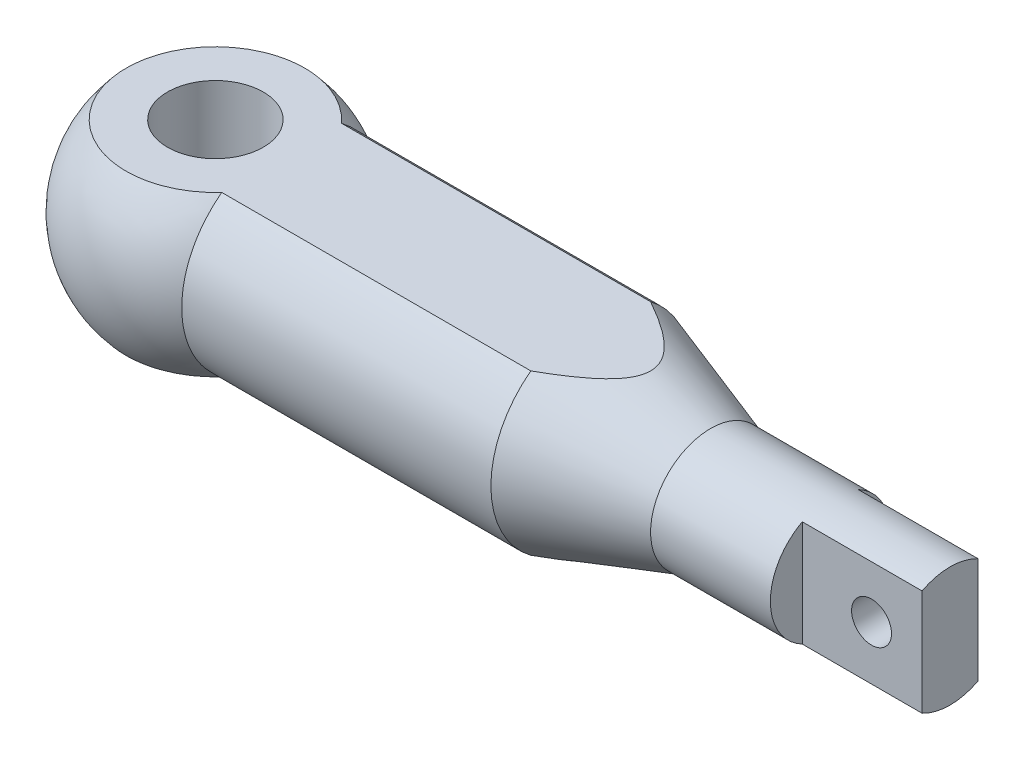
ISO-10303-21;
HEADER;
FILE_DESCRIPTION(('STEP AP214'),'2;1');
FILE_NAME('part.step','',(''),(''),'','','');
FILE_SCHEMA(('AUTOMOTIVE_DESIGN { 1 0 10303 214 1 1 1 1 }'));
ENDSEC;
DATA;
#1=APPLICATION_CONTEXT('core data for automotive mechanical design processes');
#2=APPLICATION_PROTOCOL_DEFINITION('international standard','automotive_design',2000,#1);
#3=PRODUCT_CONTEXT('',#1,'mechanical');
#4=PRODUCT('Part','Part','',(#3));
#5=PRODUCT_RELATED_PRODUCT_CATEGORY('part','',(#4));
#6=PRODUCT_DEFINITION_FORMATION('','',#4);
#7=PRODUCT_DEFINITION_CONTEXT('part definition',#1,'design');
#8=PRODUCT_DEFINITION('design','',#6,#7);
#9=PRODUCT_DEFINITION_SHAPE('','',#8);
#10=(LENGTH_UNIT() NAMED_UNIT(*) SI_UNIT(.MILLI.,.METRE.));
#11=(NAMED_UNIT(*) PLANE_ANGLE_UNIT() SI_UNIT($,.RADIAN.));
#12=(NAMED_UNIT(*) SI_UNIT($,.STERADIAN.) SOLID_ANGLE_UNIT());
#13=UNCERTAINTY_MEASURE_WITH_UNIT(LENGTH_MEASURE(1.E-05),#10,'distance_accuracy_value','');
#14=(GEOMETRIC_REPRESENTATION_CONTEXT(3) GLOBAL_UNCERTAINTY_ASSIGNED_CONTEXT((#13)) GLOBAL_UNIT_ASSIGNED_CONTEXT((#10,
#11,#12)) REPRESENTATION_CONTEXT('',''));
#15=CARTESIAN_POINT('',(0.,0.,0.));
#16=DIRECTION('',(0.,0.,1.));
#17=DIRECTION('',(1.,0.,0.));
#18=AXIS2_PLACEMENT_3D('',#15,#16,#17);
#19=CARTESIAN_POINT('',(-92.6244681900514,0.,-6.63865581350529));
#20=DIRECTION('',(1.,0.,0.));
#21=DIRECTION('',(0.,0.,-1.));
#22=AXIS2_PLACEMENT_3D('',#19,#20,#21);
#23=CYLINDRICAL_SURFACE('',#22,12.5);
#24=CARTESIAN_POINT('',(-131.332906214163,0.,-6.63865581350529));
#25=DIRECTION('',(-1.,0.,0.));
#26=DIRECTION('',(0.,0.,1.));
#27=AXIS2_PLACEMENT_3D('',#24,#25,#26);
#28=CIRCLE('',#27,12.5);
#29=CARTESIAN_POINT('',(-131.332906214163,10.,-14.1386558135053));
#30=VERTEX_POINT('',#29);
#31=CARTESIAN_POINT('',(-131.332906214163,-9.99999999999999,-14.1386558135053));
#32=VERTEX_POINT('',#31);
#33=EDGE_CURVE('E112',#30,#32,#28,.T.);
#34=ORIENTED_EDGE('',*,*,#33,.F.);
#35=DIRECTION('',(1.,0.,0.));
#36=VECTOR('',#35,1.);
#37=CARTESIAN_POINT('',(-92.6244681900514,10.,-14.1386558135053));
#38=LINE('',#37,#36);
#39=CARTESIAN_POINT('',(-92.6244681900514,10.,-14.1386558135053));
#40=VERTEX_POINT('',#39);
#41=EDGE_CURVE('E179',#30,#40,#38,.T.);
#42=ORIENTED_EDGE('',*,*,#41,.T.);
#43=CARTESIAN_POINT('',(-92.6244681900514,0.,-6.63865581350529));
#44=DIRECTION('',(1.,0.,0.));
#45=DIRECTION('',(0.,0.,-1.));
#46=AXIS2_PLACEMENT_3D('',#43,#44,#45);
#47=CIRCLE('',#46,12.5);
#48=CARTESIAN_POINT('',(-92.6244681900514,-10.,-14.1386558135053));
#49=VERTEX_POINT('',#48);
#50=EDGE_CURVE('E123',#49,#40,#47,.T.);
#51=ORIENTED_EDGE('',*,*,#50,.F.);
#52=DIRECTION('',(1.,0.,0.));
#53=VECTOR('',#52,1.);
#54=CARTESIAN_POINT('',(-92.6244681900514,-9.99999999999999,-14.1386558135053));
#55=LINE('',#54,#53);
#56=EDGE_CURVE('E58',#49,#32,#55,.F.);
#57=ORIENTED_EDGE('',*,*,#56,.T.);
#58=EDGE_LOOP('',(#34,#42,#51,#57));
#59=FACE_BOUND('',#58,.T.);
#60=ADVANCED_FACE('F37',(#59),#23,.T.);
#61=CARTESIAN_POINT('',(-92.6244681900514,10.,0.861344186494716));
#62=VERTEX_POINT('',#61);
#63=CARTESIAN_POINT('',(-92.6244681900514,-10.,0.861344186494717));
#64=VERTEX_POINT('',#63);
#65=EDGE_CURVE('E117',#62,#64,#47,.T.);
#66=ORIENTED_EDGE('',*,*,#65,.F.);
#67=DIRECTION('',(1.,0.,0.));
#68=VECTOR('',#67,1.);
#69=CARTESIAN_POINT('',(-92.6244681900514,10.,0.861344186494719));
#70=LINE('',#69,#68);
#71=CARTESIAN_POINT('',(-131.332906214163,10.,0.861344186494719));
#72=VERTEX_POINT('',#71);
#73=EDGE_CURVE('E66',#62,#72,#70,.F.);
#74=ORIENTED_EDGE('',*,*,#73,.T.);
#75=CARTESIAN_POINT('',(-131.332906214163,-9.99999999999999,0.861344186494722));
#76=VERTEX_POINT('',#75);
#77=EDGE_CURVE('E119',#76,#72,#28,.T.);
#78=ORIENTED_EDGE('',*,*,#77,.F.);
#79=DIRECTION('',(1.,0.,0.));
#80=VECTOR('',#79,1.);
#81=CARTESIAN_POINT('',(-92.6244681900514,-9.99999999999999,0.861344186494722));
#82=LINE('',#81,#80);
#83=EDGE_CURVE('E106',#76,#64,#82,.T.);
#84=ORIENTED_EDGE('',*,*,#83,.T.);
#85=EDGE_LOOP('',(#66,#74,#78,#84));
#86=FACE_BOUND('',#85,.T.);
#87=ADVANCED_FACE('F116',(#86),#23,.T.);
#88=CARTESIAN_POINT('',(-139.624468190051,0.,-6.63865581350528));
#89=DIRECTION('',(0.,0.,-1.));
#90=DIRECTION('',(1.,0.,0.));
#91=AXIS2_PLACEMENT_3D('',#88,#89,#90);
#92=SPHERICAL_SURFACE('',#91,15.);
#93=CARTESIAN_POINT('',(-139.624468190051,10.,-6.63865581350528));
#94=DIRECTION('',(0.,-1.,0.));
#95=DIRECTION('',(0.,0.,-1.));
#96=AXIS2_PLACEMENT_3D('',#93,#94,#95);
#97=CIRCLE('',#96,11.180339887499);
#98=EDGE_CURVE('E182',#30,#72,#97,.F.);
#99=ORIENTED_EDGE('',*,*,#98,.F.);
#100=ORIENTED_EDGE('',*,*,#33,.T.);
#101=CARTESIAN_POINT('',(-139.624468190051,-9.99999999999999,-6.63865581350528));
#102=DIRECTION('',(0.,1.,0.));
#103=DIRECTION('',(0.,0.,1.));
#104=AXIS2_PLACEMENT_3D('',#101,#102,#103);
#105=CIRCLE('',#104,11.180339887499);
#106=EDGE_CURVE('E120',#76,#32,#105,.F.);
#107=ORIENTED_EDGE('',*,*,#106,.F.);
#108=ORIENTED_EDGE('',*,*,#77,.T.);
#109=EDGE_LOOP('',(#99,#100,#107,#108));
#110=FACE_BOUND('',#109,.T.);
#111=ADVANCED_FACE('F39',(#110),#92,.T.);
#112=CARTESIAN_POINT('',(-92.6244681900514,0.,-6.63865581350529));
#113=DIRECTION('',(-1.,0.,0.));
#114=DIRECTION('',(0.,0.,1.));
#115=AXIS2_PLACEMENT_3D('',#112,#113,#114);
#116=CONICAL_SURFACE('',#115,12.5,0.321750554396642);
#117=CARTESIAN_POINT('',(-77.6244681900514,0.,-6.63865581350529));
#118=DIRECTION('',(1.,0.,0.));
#119=DIRECTION('',(0.,0.,-1.));
#120=AXIS2_PLACEMENT_3D('',#117,#118,#119);
#121=CIRCLE('',#120,7.5);
#122=CARTESIAN_POINT('',(-77.6244681900514,0.,-14.1386558135053));
#123=VERTEX_POINT('',#122);
#124=EDGE_CURVE('E126',#123,#123,#121,.T.);
#125=ORIENTED_EDGE('',*,*,#124,.F.);
#126=EDGE_LOOP('',(#125));
#127=FACE_BOUND('',#126,.T.);
#128=ORIENTED_EDGE('',*,*,#50,.T.);
#129=CARTESIAN_POINT('',(-121.779427664278,10.,-26.4793648692455));
#130=CARTESIAN_POINT('',(-121.130548010512,10.,-26.2371478958745));
#131=CARTESIAN_POINT('',(-120.481959643929,10.,-25.9941502551752));
#132=CARTESIAN_POINT('',(-119.185443163569,10.,-25.5063937667457));
#133=CARTESIAN_POINT('',(-118.537515051965,10.,-25.2616349132431));
#134=CARTESIAN_POINT('',(-116.594540228996,10.,-24.5243038361841));
#135=CARTESIAN_POINT('',(-115.300607495463,10.,-24.0287905336603));
#136=CARTESIAN_POINT('',(-112.705686292803,10.,-23.023586346845));
#137=CARTESIAN_POINT('',(-111.404730400938,10.,-22.5138111181957));
#138=CARTESIAN_POINT('',(-109.457386265429,10.,-21.7392200652283));
#139=CARTESIAN_POINT('',(-108.809013293169,10.,-21.479392977028));
#140=CARTESIAN_POINT('',(-107.513832788663,10.,-20.9558684319987));
#141=CARTESIAN_POINT('',(-106.867025250984,10.,-20.6921709886235));
#142=CARTESIAN_POINT('',(-105.559168002477,10.,-20.1536249826445));
#143=CARTESIAN_POINT('',(-104.898165220469,10.,-19.8786623110203));
#144=CARTESIAN_POINT('',(-103.578534767736,10.,-19.323098401483));
#145=CARTESIAN_POINT('',(-102.919907085158,10.,-19.0424971917563));
#146=CARTESIAN_POINT('',(-101.60517316354,10.,-18.4743397867359));
#147=CARTESIAN_POINT('',(-100.94906870752,10.,-18.1867794535823));
#148=CARTESIAN_POINT('',(-99.9677061908876,10.,-17.7492121246883));
#149=CARTESIAN_POINT('',(-99.6410577665366,10.,-17.6023216427271));
#150=CARTESIAN_POINT('',(-98.9888052377269,10.,-17.3062127651444));
#151=CARTESIAN_POINT('',(-98.6632011668529,10.,-17.1569942955456));
#152=CARTESIAN_POINT('',(-97.6907476711874,10.,-16.7066421734972));
#153=CARTESIAN_POINT('',(-97.0456710995572,10.,-16.401663830004));
#154=CARTESIAN_POINT('',(-95.7618439987822,10.,-15.778672010683));
#155=CARTESIAN_POINT('',(-95.123093125406,10.,-15.4606592490547));
#156=CARTESIAN_POINT('',(-94.171881892732,10.,-14.9709131981561));
#157=CARTESIAN_POINT('',(-93.856104353577,10.,-14.8056204999535));
#158=CARTESIAN_POINT('',(-93.2272208562557,10.,-14.4700358568874));
#159=CARTESIAN_POINT('',(-92.9141148233823,10.,-14.2997440524164));
#160=CARTESIAN_POINT('',(-92.2912401262045,10.,-13.9533431426747));
#161=CARTESIAN_POINT('',(-91.9814706023879,10.,-13.7772355855412));
#162=CARTESIAN_POINT('',(-91.3659967151568,10.,-13.4180708894724));
#163=CARTESIAN_POINT('',(-91.0602920314276,10.,-13.2350143025647));
#164=CARTESIAN_POINT('',(-90.6510744880192,10.,-12.9822179765534));
#165=CARTESIAN_POINT('',(-90.545284188346,10.,-12.9161554040945));
#166=CARTESIAN_POINT('',(-90.3343986992276,10.,-12.7829218531069));
#167=CARTESIAN_POINT('',(-90.2293035342014,10.,-12.7157508359272));
#168=CARTESIAN_POINT('',(-89.9151394658254,10.,-12.5124434472673));
#169=CARTESIAN_POINT('',(-89.7072159525002,10.,-12.3745274883004));
#170=CARTESIAN_POINT('',(-89.2944150842397,10.,-12.092725179218));
#171=CARTESIAN_POINT('',(-89.0895503729655,10.,-11.9488202562136));
#172=CARTESIAN_POINT('',(-88.6845287135352,10.,-11.6545366367654));
#173=CARTESIAN_POINT('',(-88.4843714292528,10.,-11.5041584047215));
#174=CARTESIAN_POINT('',(-88.074328011181,10.,-11.1834656904766));
#175=CARTESIAN_POINT('',(-87.8649346911664,10.,-11.0125169229483));
#176=CARTESIAN_POINT('',(-87.4552802995181,10.,-10.6597091720403));
#177=CARTESIAN_POINT('',(-87.2550239201953,10.,-10.4778446914302));
#178=CARTESIAN_POINT('',(-86.8680683825543,10.,-10.1017329242397));
#179=CARTESIAN_POINT('',(-86.6813136660311,10.,-9.90754338625416));
#180=CARTESIAN_POINT('',(-86.3258619879075,10.,-9.50343305887667));
#181=CARTESIAN_POINT('',(-86.157140709843,10.,-9.29353411891332));
#182=CARTESIAN_POINT('',(-85.8694688065469,10.,-8.88831486893656));
#183=CARTESIAN_POINT('',(-85.7468512675186,10.,-8.695630976746));
#184=CARTESIAN_POINT('',(-85.5277370258856,10.,-8.2954716593344));
#185=CARTESIAN_POINT('',(-85.4312336764483,10.,-8.08800001505096));
#186=CARTESIAN_POINT('',(-85.3125601728823,10.,-7.7653903994878));
#187=CARTESIAN_POINT('',(-85.2771812820496,10.,-7.65506306411063));
#188=CARTESIAN_POINT('',(-85.2167943490211,10.,-7.43163012086403));
#189=CARTESIAN_POINT('',(-85.1917802050758,10.,-7.31852618924683));
#190=CARTESIAN_POINT('',(-85.1531457710165,10.,-7.09054737959656));
#191=CARTESIAN_POINT('',(-85.1395084053625,10.,-6.97567542012015));
#192=CARTESIAN_POINT('',(-85.1241781954301,10.,-6.74513793843437));
#193=CARTESIAN_POINT('',(-85.1224836674986,10.,-6.6294725303836));
#194=CARTESIAN_POINT('',(-85.130538042847,10.,-6.41394619089712));
#195=CARTESIAN_POINT('',(-85.1387969314058,10.,-6.31402656858507));
#196=CARTESIAN_POINT('',(-85.1640482191576,10.,-6.11528356992301));
#197=CARTESIAN_POINT('',(-85.1810433545721,10.,-6.01646054694397));
#198=CARTESIAN_POINT('',(-85.2444016521969,10.,-5.72255745245934));
#199=CARTESIAN_POINT('',(-85.3031356503108,10.,-5.53008838833639));
#200=CARTESIAN_POINT('',(-85.4791313536976,10.,-5.07336320843947));
#201=CARTESIAN_POINT('',(-85.6107725042014,10.,-4.81475657556555));
#202=CARTESIAN_POINT('',(-85.8360679699195,10.,-4.44435317280927));
#203=CARTESIAN_POINT('',(-85.9159618993719,10.,-4.32361661634781));
#204=CARTESIAN_POINT('',(-86.0833968785817,10.,-4.08754587768241));
#205=CARTESIAN_POINT('',(-86.1709367824841,10.,-3.972210889945));
#206=CARTESIAN_POINT('',(-86.3791813698784,10.,-3.71297535058039));
#207=CARTESIAN_POINT('',(-86.5020029099159,10.,-3.57078829891719));
#208=CARTESIAN_POINT('',(-86.7557380294605,10.,-3.29378035424066));
#209=CARTESIAN_POINT('',(-86.8866550372844,10.,-3.15896262819907));
#210=CARTESIAN_POINT('',(-87.155023973138,10.,-2.89559165698478));
#211=CARTESIAN_POINT('',(-87.2924860619355,10.,-2.76704882396673));
#212=CARTESIAN_POINT('',(-87.5724806417713,10.,-2.51560225965869));
#213=CARTESIAN_POINT('',(-87.7150137430307,10.,-2.39269921113561));
#214=CARTESIAN_POINT('',(-88.0050988947102,10.,-2.1510569181334));
#215=CARTESIAN_POINT('',(-88.1526772032976,10.,-2.03234931132239));
#216=CARTESIAN_POINT('',(-88.4512424769914,10.,-1.79930600168197));
#217=CARTESIAN_POINT('',(-88.6022295406411,10.,-1.68497042550109));
#218=CARTESIAN_POINT('',(-88.9068689069805,10.,-1.46027219360815));
#219=CARTESIAN_POINT('',(-89.0605180988144,10.,-1.34990531050153));
#220=CARTESIAN_POINT('',(-89.3701937752465,10.,-1.13257983059544));
#221=CARTESIAN_POINT('',(-89.5262201807671,10.,-1.02562112078812));
#222=CARTESIAN_POINT('',(-90.0271425326426,10.,-0.68924381861643));
#223=CARTESIAN_POINT('',(-90.3758797258183,10.,-0.465536504530645));
#224=CARTESIAN_POINT('',(-91.0804032941863,10.,-0.0294687092985742));
#225=CARTESIAN_POINT('',(-91.4361909963034,10.,0.182889607593393));
#226=CARTESIAN_POINT('',(-92.1532902691,10.,0.598546631409221));
#227=CARTESIAN_POINT('',(-92.5146050394002,10.,0.801839801654843));
#228=CARTESIAN_POINT('',(-93.2413806923521,10.,1.20088093739061));
#229=CARTESIAN_POINT('',(-93.6068417395236,10.,1.39662860211827));
#230=CARTESIAN_POINT('',(-94.3419556761872,10.,1.78229265313027));
#231=CARTESIAN_POINT('',(-94.7116166064266,10.,1.97219367817914));
#232=CARTESIAN_POINT('',(-95.4536418412524,10.,2.34663863102585));
#233=CARTESIAN_POINT('',(-95.8260061855296,10.,2.53118247997126));
#234=CARTESIAN_POINT('',(-96.9461541237873,10.,3.07784527268013));
#235=CARTESIAN_POINT('',(-97.6972694467925,10.,3.43313901939832));
#236=CARTESIAN_POINT('',(-99.2059989911005,10.,4.13014345674073));
#237=CARTESIAN_POINT('',(-99.9636150435168,10.,4.47185015655672));
#238=CARTESIAN_POINT('',(-101.483619898479,10.,5.14462597447941));
#239=CARTESIAN_POINT('',(-102.246009087311,10.,5.47569421797067));
#240=CARTESIAN_POINT('',(-103.773381898249,10.,6.12889292375882));
#241=CARTESIAN_POINT('',(-104.538360636964,10.,6.45103483390411));
#242=CARTESIAN_POINT('',(-106.07118803492,10.,7.08842378886193));
#243=CARTESIAN_POINT('',(-106.839036719381,10.,7.40367077291739));
#244=CARTESIAN_POINT('',(-108.784524355811,10.,8.1940228960026));
#245=CARTESIAN_POINT('',(-109.963709501017,10.,8.66531983989661));
#246=CARTESIAN_POINT('',(-112.326535582103,10.,9.59791537304427));
#247=CARTESIAN_POINT('',(-113.510178048794,10.,10.0592100719076));
#248=CARTESIAN_POINT('',(-115.873646267416,10.,10.971108714592));
#249=CARTESIAN_POINT('',(-117.053454039263,10.,11.4217593070549));
#250=CARTESIAN_POINT('',(-118.824732265606,10.,12.0928533082314));
#251=CARTESIAN_POINT('',(-119.415297167862,10.,12.315692090481));
#252=CARTESIAN_POINT('',(-120.596969701823,10.,12.759921623285));
#253=CARTESIAN_POINT('',(-121.188077332152,10.,12.9813123774938));
#254=CARTESIAN_POINT('',(-121.779427664278,10.,13.2020532422349));
#255=B_SPLINE_CURVE_WITH_KNOTS('',3,(#129,#130,#131,#132,#133,#134,#135,#136,#137,#138,#139,
#140,#141,#142,#143,#144,#145,#146,#147,#148,#149,#150,#151,#152,#153,#154,#155,#156,#157,#158,
#159,#160,#161,#162,#163,#164,#165,#166,#167,#168,#169,#170,#171,#172,#173,#174,#175,#176,#177,
#178,#179,#180,#181,#182,#183,#184,#185,#186,#187,#188,#189,#190,#191,#192,#193,#194,#195,#196,
#197,#198,#199,#200,#201,#202,#203,#204,#205,#206,#207,#208,#209,#210,#211,#212,#213,#214,#215,
#216,#217,#218,#219,#220,#221,#222,#223,#224,#225,#226,#227,#228,#229,#230,#231,#232,#233,#234,
#235,#236,#237,#238,#239,#240,#241,#242,#243,#244,#245,#246,#247,#248,#249,#250,#251,#252,#253,
#254),.UNSPECIFIED.,.F.,.F.,(4,2,2,2,2,2,2,2,2,2,2,2,2,2,2,2,2,2,2,2,2,2,2,2,2,2,2,2,2,2,2,2,2,
2,2,2,2,2,2,2,2,2,2,2,2,2,2,2,2,2,2,2,2,2,2,2,2,2,2,2,2,2,4),(0.,2.07784079226609,
4.1556883977276,8.31235832884665,12.5040982331671,14.5995783718643,16.6950512281561,
18.8427633084303,20.9904646552132,23.1394760123076,24.2139372932799,25.2884327875263,
27.4289369859961,29.5693240554376,30.6385569983181,31.7077599420451,32.7766805254724,
33.8455163713428,34.2196800068938,34.5938567170594,35.3422945358452,36.0932574067162,
36.8441664924664,37.6548140602384,38.4658733581892,39.2733788849573,40.0797814490502,
40.7635639148115,41.4471721736793,41.7943389039245,42.1413009649734,42.4877413248641,
42.8341328440093,43.1345169058456,43.4349951063431,44.0360849099875,44.90149260465,
45.3356458481125,45.7697341389827,46.3330058157141,46.896517685758,47.460934864786,
48.0254201943168,48.593513822463,49.1616238946367,49.7291097283902,50.2965767258867,
51.5392190751778,52.7820975569757,54.0257250299393,55.2694020225167,56.5161076326265,
57.7628315837391,60.2553442706587,62.7485837341998,65.242027651797,67.7321100025987,
70.2222142867966,74.0317900550515,77.8428219069909,81.6316351279295,83.5252588428658,
85.4188777767527),.UNSPECIFIED.);
#256=EDGE_CURVE('E11',#40,#62,#255,.T.);
#257=ORIENTED_EDGE('',*,*,#256,.T.);
#258=ORIENTED_EDGE('',*,*,#65,.T.);
#259=CARTESIAN_POINT('',(-121.779427664278,-10.,13.2020532422349));
#260=CARTESIAN_POINT('',(-121.130548010512,-10.,12.9598362688639));
#261=CARTESIAN_POINT('',(-120.481959643929,-10.,12.7168386281646));
#262=CARTESIAN_POINT('',(-119.185443163569,-10.,12.2290821397351));
#263=CARTESIAN_POINT('',(-118.537515051965,-10.,11.9843232862326));
#264=CARTESIAN_POINT('',(-116.594540228996,-10.,11.2469922091735));
#265=CARTESIAN_POINT('',(-115.300607495463,-10.,10.7514789066497));
#266=CARTESIAN_POINT('',(-112.705686292803,-10.,9.74627471983443));
#267=CARTESIAN_POINT('',(-111.404730400938,-10.,9.23649949118516));
#268=CARTESIAN_POINT('',(-109.457386265429,-10.,8.46190843821771));
#269=CARTESIAN_POINT('',(-108.809013293169,-10.,8.20208135001744));
#270=CARTESIAN_POINT('',(-107.513832788663,-10.,7.67855680498813));
#271=CARTESIAN_POINT('',(-106.867025250984,-10.,7.41485936161289));
#272=CARTESIAN_POINT('',(-105.559168002477,-10.,6.87631335563392));
#273=CARTESIAN_POINT('',(-104.898165220469,-10.,6.60135068400978));
#274=CARTESIAN_POINT('',(-103.578534767736,-10.,6.04578677447247));
#275=CARTESIAN_POINT('',(-102.919907085158,-10.,5.76518556474571));
#276=CARTESIAN_POINT('',(-101.60517316354,-10.,5.19702815972537));
#277=CARTESIAN_POINT('',(-100.94906870752,-10.,4.90946782657176));
#278=CARTESIAN_POINT('',(-99.9677061908875,-10.,4.47190049767771));
#279=CARTESIAN_POINT('',(-99.6410577665365,-10.,4.32501001571656));
#280=CARTESIAN_POINT('',(-98.9888052377268,-10.,4.02890113813377));
#281=CARTESIAN_POINT('',(-98.6632011668528,-10.,3.87968266853503));
#282=CARTESIAN_POINT('',(-97.6907476711874,-10.,3.42933054648662));
#283=CARTESIAN_POINT('',(-97.0456710995572,-10.,3.12435220299347));
#284=CARTESIAN_POINT('',(-95.7618439987822,-10.,2.50136038367245));
#285=CARTESIAN_POINT('',(-95.123093125406,-10.,2.1833476220441));
#286=CARTESIAN_POINT('',(-94.171881892732,-10.,1.69360157114553));
#287=CARTESIAN_POINT('',(-93.856104353577,-10.,1.52830887294291));
#288=CARTESIAN_POINT('',(-93.2272208562557,-10.,1.19272422987682));
#289=CARTESIAN_POINT('',(-92.9141148233823,-10.,1.02243242540585));
#290=CARTESIAN_POINT('',(-92.2912401262046,-10.,0.676031515664101));
#291=CARTESIAN_POINT('',(-91.981470602388,-10.,0.499923958530632));
#292=CARTESIAN_POINT('',(-91.3659967151568,-10.,0.140759262461888));
#293=CARTESIAN_POINT('',(-91.0602920314276,-10.,-0.0422973244458639));
#294=CARTESIAN_POINT('',(-90.6510744880192,-10.,-0.295093650457177));
#295=CARTESIAN_POINT('',(-90.545284188346,-10.,-0.361156222916049));
#296=CARTESIAN_POINT('',(-90.3343986992276,-10.,-0.494389773903663));
#297=CARTESIAN_POINT('',(-90.2293035342014,-10.,-0.561560791083407));
#298=CARTESIAN_POINT('',(-89.9151394658254,-10.,-0.764868179743285));
#299=CARTESIAN_POINT('',(-89.7072159525002,-10.,-0.902784138710195));
#300=CARTESIAN_POINT('',(-89.2944150842397,-10.,-1.18458644779257));
#301=CARTESIAN_POINT('',(-89.0895503729655,-10.,-1.32849137079694));
#302=CARTESIAN_POINT('',(-88.6845287135352,-10.,-1.62277499024513));
#303=CARTESIAN_POINT('',(-88.4843714292528,-10.,-1.77315322228911));
#304=CARTESIAN_POINT('',(-88.074328011181,-10.,-2.09384593653395));
#305=CARTESIAN_POINT('',(-87.8649346911664,-10.,-2.26479470406227));
#306=CARTESIAN_POINT('',(-87.4552802995181,-10.,-2.61760245497028));
#307=CARTESIAN_POINT('',(-87.2550239201953,-10.,-2.79946693558041));
#308=CARTESIAN_POINT('',(-86.8680683825543,-10.,-3.17557870277093));
#309=CARTESIAN_POINT('',(-86.681313666031,-10.,-3.36976824075642));
#310=CARTESIAN_POINT('',(-86.3258619879075,-10.,-3.77387856813392));
#311=CARTESIAN_POINT('',(-86.157140709843,-10.,-3.98377750809726));
#312=CARTESIAN_POINT('',(-85.8694688065469,-10.,-4.38899675807403));
#313=CARTESIAN_POINT('',(-85.7468512675185,-10.,-4.58168065026459));
#314=CARTESIAN_POINT('',(-85.5277370258856,-10.,-4.98183996767619));
#315=CARTESIAN_POINT('',(-85.4312336764482,-10.,-5.18931161195963));
#316=CARTESIAN_POINT('',(-85.3125601728823,-10.,-5.51192122752279));
#317=CARTESIAN_POINT('',(-85.2771812820496,-10.,-5.62224856289996));
#318=CARTESIAN_POINT('',(-85.2167943490211,-10.,-5.84568150614656));
#319=CARTESIAN_POINT('',(-85.1917802050758,-10.,-5.95878543776376));
#320=CARTESIAN_POINT('',(-85.1531457710165,-10.,-6.18676424741403));
#321=CARTESIAN_POINT('',(-85.1395084053625,-10.,-6.30163620689044));
#322=CARTESIAN_POINT('',(-85.1241781954301,-10.,-6.53217368857622));
#323=CARTESIAN_POINT('',(-85.1224836674985,-10.,-6.64783909662699));
#324=CARTESIAN_POINT('',(-85.130538042847,-10.,-6.86336543611347));
#325=CARTESIAN_POINT('',(-85.1387969314058,-10.,-6.96328505842552));
#326=CARTESIAN_POINT('',(-85.1640482191576,-10.,-7.16202805708758));
#327=CARTESIAN_POINT('',(-85.1810433545721,-10.,-7.26085108006662));
#328=CARTESIAN_POINT('',(-85.2444016521969,-10.,-7.55475417455125));
#329=CARTESIAN_POINT('',(-85.3031356503108,-10.,-7.74722323867419));
#330=CARTESIAN_POINT('',(-85.4791313536976,-10.,-8.20394841857112));
#331=CARTESIAN_POINT('',(-85.6107725042014,-10.,-8.46255505144504));
#332=CARTESIAN_POINT('',(-85.8360679699195,-10.,-8.83295845420132));
#333=CARTESIAN_POINT('',(-85.9159618993719,-10.,-8.95369501066278));
#334=CARTESIAN_POINT('',(-86.0833968785818,-10.,-9.18976574932818));
#335=CARTESIAN_POINT('',(-86.1709367824841,-10.,-9.30510073706559));
#336=CARTESIAN_POINT('',(-86.3791813698784,-10.,-9.5643362764302));
#337=CARTESIAN_POINT('',(-86.502002909916,-10.,-9.7065233280934));
#338=CARTESIAN_POINT('',(-86.7557380294605,-10.,-9.98353127276994));
#339=CARTESIAN_POINT('',(-86.8866550372844,-10.,-10.1183489988115));
#340=CARTESIAN_POINT('',(-87.155023973138,-10.,-10.3817199700258));
#341=CARTESIAN_POINT('',(-87.2924860619355,-10.,-10.5102628030439));
#342=CARTESIAN_POINT('',(-87.5724806417713,-10.,-10.7617093673519));
#343=CARTESIAN_POINT('',(-87.7150137430307,-10.,-10.884612415875));
#344=CARTESIAN_POINT('',(-88.0050988947102,-10.,-11.1262547088772));
#345=CARTESIAN_POINT('',(-88.1526772032976,-10.,-11.2449623156882));
#346=CARTESIAN_POINT('',(-88.4512424769915,-10.,-11.4780056253286));
#347=CARTESIAN_POINT('',(-88.6022295406412,-10.,-11.5923412015095));
#348=CARTESIAN_POINT('',(-88.9068689069805,-10.,-11.8170394334025));
#349=CARTESIAN_POINT('',(-89.0605180988145,-10.,-11.9274063165091));
#350=CARTESIAN_POINT('',(-89.3701937752466,-10.,-12.1447317964152));
#351=CARTESIAN_POINT('',(-89.5262201807672,-10.,-12.2516905062225));
#352=CARTESIAN_POINT('',(-90.0271425326427,-10.,-12.5880678083942));
#353=CARTESIAN_POINT('',(-90.3758797258183,-10.,-12.81177512248));
#354=CARTESIAN_POINT('',(-91.0804032941864,-10.,-13.247842917712));
#355=CARTESIAN_POINT('',(-91.4361909963035,-10.,-13.460201234604));
#356=CARTESIAN_POINT('',(-92.1532902691001,-10.,-13.8758582584198));
#357=CARTESIAN_POINT('',(-92.5146050394003,-10.,-14.0791514286655));
#358=CARTESIAN_POINT('',(-93.2413806923522,-10.,-14.4781925644012));
#359=CARTESIAN_POINT('',(-93.6068417395237,-10.,-14.6739402291289));
#360=CARTESIAN_POINT('',(-94.3419556761873,-10.,-15.0596042801409));
#361=CARTESIAN_POINT('',(-94.7116166064268,-10.,-15.2495053051898));
#362=CARTESIAN_POINT('',(-95.4536418412525,-10.,-15.6239502580365));
#363=CARTESIAN_POINT('',(-95.8260061855298,-10.,-15.8084941069819));
#364=CARTESIAN_POINT('',(-96.9461541237874,-10.,-16.3551568996908));
#365=CARTESIAN_POINT('',(-97.6972694467927,-10.,-16.710450646409));
#366=CARTESIAN_POINT('',(-99.2059989911007,-10.,-17.4074550837514));
#367=CARTESIAN_POINT('',(-99.963615043517,-10.,-17.7491617835674));
#368=CARTESIAN_POINT('',(-101.483619898479,-10.,-18.4219376014901));
#369=CARTESIAN_POINT('',(-102.246009087311,-10.,-18.7530058449813));
#370=CARTESIAN_POINT('',(-103.773381898249,-10.,-19.4062045507695));
#371=CARTESIAN_POINT('',(-104.538360636964,-10.,-19.7283464609148));
#372=CARTESIAN_POINT('',(-106.07118803492,-10.,-20.3657354158726));
#373=CARTESIAN_POINT('',(-106.839036719381,-10.,-20.6809823999281));
#374=CARTESIAN_POINT('',(-108.784524355811,-10.,-21.4713345230133));
#375=CARTESIAN_POINT('',(-109.963709501017,-10.,-21.9426314669073));
#376=CARTESIAN_POINT('',(-112.326535582103,-10.,-22.8752270000549));
#377=CARTESIAN_POINT('',(-113.510178048794,-10.,-23.3365216989183));
#378=CARTESIAN_POINT('',(-115.873646267416,-10.,-24.2484203416026));
#379=CARTESIAN_POINT('',(-117.053454039263,-10.,-24.6990709340655));
#380=CARTESIAN_POINT('',(-118.824732265606,-10.,-25.370164935242));
#381=CARTESIAN_POINT('',(-119.415297167862,-10.,-25.5930037174916));
#382=CARTESIAN_POINT('',(-120.596969701823,-10.,-26.0372332502955));
#383=CARTESIAN_POINT('',(-121.188077332152,-10.,-26.2586240045044));
#384=CARTESIAN_POINT('',(-121.779427664278,-10.,-26.4793648692455));
#385=B_SPLINE_CURVE_WITH_KNOTS('',3,(#259,#260,#261,#262,#263,#264,#265,#266,#267,#268,#269,
#270,#271,#272,#273,#274,#275,#276,#277,#278,#279,#280,#281,#282,#283,#284,#285,#286,#287,#288,
#289,#290,#291,#292,#293,#294,#295,#296,#297,#298,#299,#300,#301,#302,#303,#304,#305,#306,#307,
#308,#309,#310,#311,#312,#313,#314,#315,#316,#317,#318,#319,#320,#321,#322,#323,#324,#325,#326,
#327,#328,#329,#330,#331,#332,#333,#334,#335,#336,#337,#338,#339,#340,#341,#342,#343,#344,#345,
#346,#347,#348,#349,#350,#351,#352,#353,#354,#355,#356,#357,#358,#359,#360,#361,#362,#363,#364,
#365,#366,#367,#368,#369,#370,#371,#372,#373,#374,#375,#376,#377,#378,#379,#380,#381,#382,#383,
#384),.UNSPECIFIED.,.F.,.F.,(4,2,2,2,2,2,2,2,2,2,2,2,2,2,2,2,2,2,2,2,2,2,2,2,2,2,2,2,2,2,2,2,2,
2,2,2,2,2,2,2,2,2,2,2,2,2,2,2,2,2,2,2,2,2,2,2,2,2,2,2,2,2,4),(0.,2.07784079226609,
4.1556883977276,8.31235832884665,12.5040982331671,14.5995783718643,16.6950512281561,
18.8427633084303,20.9904646552132,23.1394760123076,24.2139372932799,25.2884327875263,
27.4289369859961,29.5693240554376,30.6385569983181,31.707759942045,32.7766805254724,
33.8455163713428,34.2196800068938,34.5938567170594,35.3422945358452,36.0932574067162,
36.8441664924664,37.6548140602384,38.4658733581892,39.2733788849574,40.0797814490502,
40.7635639148115,41.4471721736794,41.7943389039246,42.1413009649735,42.4877413248641,
42.8341328440094,43.1345169058456,43.4349951063431,44.0360849099875,44.90149260465,
45.3356458481126,45.7697341389827,46.3330058157141,46.8965176857581,47.4609348647861,
48.0254201943168,48.593513822463,49.1616238946368,49.7291097283903,50.2965767258868,
51.5392190751779,52.7820975569758,54.0257250299394,55.2694020225168,56.5161076326267,
57.7628315837393,60.255344270659,62.7485837342,65.2420276517973,67.732110002599,
70.2222142867969,74.0317900550517,77.8428219069911,81.6316351279296,83.5252588428658,
85.4188777767527),.UNSPECIFIED.);
#386=EDGE_CURVE('E51',#64,#49,#385,.T.);
#387=ORIENTED_EDGE('',*,*,#386,.T.);
#388=EDGE_LOOP('',(#128,#257,#258,#387));
#389=FACE_BOUND('',#388,.T.);
#390=ADVANCED_FACE('F122',(#127,#389),#116,.T.);
#391=CARTESIAN_POINT('',(-62.6244681900515,0.,-6.63865581350528));
#392=DIRECTION('',(-1.,0.,0.));
#393=DIRECTION('',(0.,0.,1.));
#394=AXIS2_PLACEMENT_3D('',#391,#392,#393);
#395=CYLINDRICAL_SURFACE('',#394,7.5);
#396=ORIENTED_EDGE('',*,*,#124,.T.);
#397=EDGE_LOOP('',(#396));
#398=FACE_BOUND('',#397,.T.);
#399=DIRECTION('',(-1.,0.,0.));
#400=VECTOR('',#399,1.);
#401=CARTESIAN_POINT('',(-47.6244681900515,-6.6332495807108,-3.13865581350528));
#402=LINE('',#401,#400);
#403=CARTESIAN_POINT('',(-47.6244681900515,-6.6332495807108,-3.13865581350528));
#404=VERTEX_POINT('',#403);
#405=CARTESIAN_POINT('',(-62.6244681900515,-6.6332495807108,-3.13865581350528));
#406=VERTEX_POINT('',#405);
#407=EDGE_CURVE('E197',#404,#406,#402,.T.);
#408=ORIENTED_EDGE('',*,*,#407,.T.);
#409=CARTESIAN_POINT('',(-62.6244681900515,0.,-6.63865581350528));
#410=DIRECTION('',(1.,0.,0.));
#411=DIRECTION('',(0.,0.,-1.));
#412=AXIS2_PLACEMENT_3D('',#409,#410,#411);
#413=CIRCLE('',#412,7.5);
#414=CARTESIAN_POINT('',(-62.6244681900515,6.6332495807108,-3.13865581350528));
#415=VERTEX_POINT('',#414);
#416=EDGE_CURVE('E212',#415,#406,#413,.T.);
#417=ORIENTED_EDGE('',*,*,#416,.F.);
#418=DIRECTION('',(-1.,0.,0.));
#419=VECTOR('',#418,1.);
#420=CARTESIAN_POINT('',(-47.6244681900515,6.6332495807108,-3.13865581350528));
#421=LINE('',#420,#419);
#422=CARTESIAN_POINT('',(-47.6244681900515,6.6332495807108,-3.13865581350528));
#423=VERTEX_POINT('',#422);
#424=EDGE_CURVE('E200',#423,#415,#421,.T.);
#425=ORIENTED_EDGE('',*,*,#424,.F.);
#426=CARTESIAN_POINT('',(-47.6244681900515,0.,-6.63865581350528));
#427=DIRECTION('',(1.,0.,0.));
#428=DIRECTION('',(0.,0.,-1.));
#429=AXIS2_PLACEMENT_3D('',#426,#427,#428);
#430=CIRCLE('',#429,7.5);
#431=CARTESIAN_POINT('',(-47.6244681900515,6.6332495807108,-10.1386558135053));
#432=VERTEX_POINT('',#431);
#433=EDGE_CURVE('E186',#432,#423,#430,.T.);
#434=ORIENTED_EDGE('',*,*,#433,.F.);
#435=DIRECTION('',(-1.,0.,0.));
#436=VECTOR('',#435,1.);
#437=CARTESIAN_POINT('',(-47.6244681900515,6.6332495807108,-10.1386558135053));
#438=LINE('',#437,#436);
#439=CARTESIAN_POINT('',(-62.6244681900515,6.6332495807108,-10.1386558135053));
#440=VERTEX_POINT('',#439);
#441=EDGE_CURVE('E202',#432,#440,#438,.T.);
#442=ORIENTED_EDGE('',*,*,#441,.T.);
#443=CARTESIAN_POINT('',(-62.6244681900515,0.,-6.63865581350528));
#444=DIRECTION('',(1.,0.,0.));
#445=DIRECTION('',(0.,0.,-1.));
#446=AXIS2_PLACEMENT_3D('',#443,#444,#445);
#447=CIRCLE('',#446,7.5);
#448=CARTESIAN_POINT('',(-62.6244681900515,-6.6332495807108,-10.1386558135053));
#449=VERTEX_POINT('',#448);
#450=EDGE_CURVE('E205',#449,#440,#447,.T.);
#451=ORIENTED_EDGE('',*,*,#450,.F.);
#452=DIRECTION('',(-1.,0.,0.));
#453=VECTOR('',#452,1.);
#454=CARTESIAN_POINT('',(-47.6244681900515,-6.6332495807108,-10.1386558135053));
#455=LINE('',#454,#453);
#456=CARTESIAN_POINT('',(-47.6244681900515,-6.6332495807108,-10.1386558135053));
#457=VERTEX_POINT('',#456);
#458=EDGE_CURVE('E195',#457,#449,#455,.T.);
#459=ORIENTED_EDGE('',*,*,#458,.F.);
#460=EDGE_CURVE('E193',#404,#457,#430,.T.);
#461=ORIENTED_EDGE('',*,*,#460,.F.);
#462=EDGE_LOOP('',(#408,#417,#425,#434,#442,#451,#459,#461));
#463=FACE_BOUND('',#462,.T.);
#464=ADVANCED_FACE('F161',(#398,#463),#395,.T.);
#465=CARTESIAN_POINT('',(-62.6244681900515,0.,0.));
#466=DIRECTION('',(1.,0.,0.));
#467=DIRECTION('',(0.,0.,-1.));
#468=AXIS2_PLACEMENT_3D('',#465,#466,#467);
#469=PLANE('',#468);
#470=DIRECTION('',(0.,-1.,0.));
#471=VECTOR('',#470,1.);
#472=CARTESIAN_POINT('',(-62.6244681900515,0.,-3.13865581350528));
#473=LINE('',#472,#471);
#474=EDGE_CURVE('E211',#415,#406,#473,.T.);
#475=ORIENTED_EDGE('',*,*,#474,.F.);
#476=ORIENTED_EDGE('',*,*,#416,.T.);
#477=EDGE_LOOP('',(#475,#476));
#478=FACE_BOUND('',#477,.T.);
#479=ADVANCED_FACE('F158',(#478),#469,.T.);
#480=CARTESIAN_POINT('',(-62.6244681900515,0.,0.));
#481=DIRECTION('',(1.,0.,0.));
#482=DIRECTION('',(0.,0.,-1.));
#483=AXIS2_PLACEMENT_3D('',#480,#481,#482);
#484=PLANE('',#483);
#485=ORIENTED_EDGE('',*,*,#450,.T.);
#486=DIRECTION('',(0.,-1.,0.));
#487=VECTOR('',#486,1.);
#488=CARTESIAN_POINT('',(-62.6244681900515,0.,-10.1386558135053));
#489=LINE('',#488,#487);
#490=EDGE_CURVE('E208',#440,#449,#489,.T.);
#491=ORIENTED_EDGE('',*,*,#490,.T.);
#492=EDGE_LOOP('',(#485,#491));
#493=FACE_BOUND('',#492,.T.);
#494=ADVANCED_FACE('F154',(#493),#484,.T.);
#495=CARTESIAN_POINT('',(-47.6244681900515,0.,-10.1386558135053));
#496=DIRECTION('',(0.,0.,-1.));
#497=DIRECTION('',(-1.,0.,0.));
#498=AXIS2_PLACEMENT_3D('',#495,#496,#497);
#499=PLANE('',#498);
#500=CARTESIAN_POINT('',(-53.9572602101798,0.0899999999999998,-10.1386558135053));
#501=DIRECTION('',(0.,0.,-1.));
#502=DIRECTION('',(-1.,0.,0.));
#503=AXIS2_PLACEMENT_3D('',#500,#501,#502);
#504=CIRCLE('',#503,2.5);
#505=CARTESIAN_POINT('',(-51.4572602101798,0.0899999999999998,-10.1386558135053));
#506=VERTEX_POINT('',#505);
#507=EDGE_CURVE('E236',#506,#506,#504,.T.);
#508=ORIENTED_EDGE('',*,*,#507,.F.);
#509=EDGE_LOOP('',(#508));
#510=FACE_BOUND('',#509,.T.);
#511=ORIENTED_EDGE('',*,*,#458,.T.);
#512=ORIENTED_EDGE('',*,*,#490,.F.);
#513=ORIENTED_EDGE('',*,*,#441,.F.);
#514=DIRECTION('',(0.,-1.,0.));
#515=VECTOR('',#514,1.);
#516=CARTESIAN_POINT('',(-47.6244681900515,0.,-10.1386558135053));
#517=LINE('',#516,#515);
#518=EDGE_CURVE('E183',#432,#457,#517,.T.);
#519=ORIENTED_EDGE('',*,*,#518,.T.);
#520=EDGE_LOOP('',(#511,#512,#513,#519));
#521=FACE_BOUND('',#520,.T.);
#522=ADVANCED_FACE('F150',(#510,#521),#499,.T.);
#523=CARTESIAN_POINT('',(-47.6244681900515,0.,-3.13865581350528));
#524=DIRECTION('',(0.,0.,-1.));
#525=DIRECTION('',(-1.,0.,0.));
#526=AXIS2_PLACEMENT_3D('',#523,#524,#525);
#527=PLANE('',#526);
#528=CARTESIAN_POINT('',(-53.9572602101798,0.0899999999999998,-3.13865581350528));
#529=DIRECTION('',(0.,0.,1.));
#530=DIRECTION('',(1.,0.,0.));
#531=AXIS2_PLACEMENT_3D('',#528,#529,#530);
#532=CIRCLE('',#531,2.5);
#533=CARTESIAN_POINT('',(-51.4572602101798,0.0899999999999998,-3.13865581350525));
#534=VERTEX_POINT('',#533);
#535=EDGE_CURVE('E239',#534,#534,#532,.T.);
#536=ORIENTED_EDGE('',*,*,#535,.F.);
#537=EDGE_LOOP('',(#536));
#538=FACE_BOUND('',#537,.T.);
#539=ORIENTED_EDGE('',*,*,#474,.T.);
#540=ORIENTED_EDGE('',*,*,#407,.F.);
#541=DIRECTION('',(0.,-1.,0.));
#542=VECTOR('',#541,1.);
#543=CARTESIAN_POINT('',(-47.6244681900515,0.,-3.13865581350528));
#544=LINE('',#543,#542);
#545=EDGE_CURVE('E192',#423,#404,#544,.T.);
#546=ORIENTED_EDGE('',*,*,#545,.F.);
#547=ORIENTED_EDGE('',*,*,#424,.T.);
#548=EDGE_LOOP('',(#539,#540,#546,#547));
#549=FACE_BOUND('',#548,.T.);
#550=ADVANCED_FACE('F146',(#538,#549),#527,.F.);
#551=CARTESIAN_POINT('',(-47.6244681900515,0.,0.));
#552=DIRECTION('',(1.,0.,0.));
#553=DIRECTION('',(0.,0.,-1.));
#554=AXIS2_PLACEMENT_3D('',#551,#552,#553);
#555=PLANE('',#554);
#556=ORIENTED_EDGE('',*,*,#518,.F.);
#557=ORIENTED_EDGE('',*,*,#433,.T.);
#558=ORIENTED_EDGE('',*,*,#545,.T.);
#559=ORIENTED_EDGE('',*,*,#460,.T.);
#560=EDGE_LOOP('',(#556,#557,#558,#559));
#561=FACE_BOUND('',#560,.T.);
#562=ADVANCED_FACE('F140',(#561),#555,.T.);
#563=CARTESIAN_POINT('',(-176.624468190052,-10.,-6.63865581350528));
#564=DIRECTION('',(0.,1.,0.));
#565=DIRECTION('',(0.,0.,1.));
#566=AXIS2_PLACEMENT_3D('',#563,#564,#565);
#567=PLANE('',#566);
#568=CARTESIAN_POINT('',(-139.624468190051,-9.99999999999999,-6.63865581350528));
#569=DIRECTION('',(0.,1.,0.));
#570=DIRECTION('',(0.,0.,1.));
#571=AXIS2_PLACEMENT_3D('',#568,#569,#570);
#572=CIRCLE('',#571,6.00000000000002);
#573=CARTESIAN_POINT('',(-139.624468190051,-10.,-0.638655813505268));
#574=VERTEX_POINT('',#573);
#575=EDGE_CURVE('E230',#574,#574,#572,.T.);
#576=ORIENTED_EDGE('',*,*,#575,.T.);
#577=EDGE_LOOP('',(#576));
#578=FACE_BOUND('',#577,.T.);
#579=ORIENTED_EDGE('',*,*,#106,.T.);
#580=ORIENTED_EDGE('',*,*,#56,.F.);
#581=ORIENTED_EDGE('',*,*,#386,.F.);
#582=ORIENTED_EDGE('',*,*,#83,.F.);
#583=EDGE_LOOP('',(#579,#580,#581,#582));
#584=FACE_BOUND('',#583,.T.);
#585=ADVANCED_FACE('F105',(#578,#584),#567,.F.);
#586=CARTESIAN_POINT('',(-176.624468190052,10.,-6.63865581350528));
#587=DIRECTION('',(0.,-1.,0.));
#588=DIRECTION('',(0.,0.,-1.));
#589=AXIS2_PLACEMENT_3D('',#586,#587,#588);
#590=PLANE('',#589);
#591=CARTESIAN_POINT('',(-139.624468190051,10.,-6.63865581350528));
#592=DIRECTION('',(0.,1.,0.));
#593=DIRECTION('',(0.,0.,1.));
#594=AXIS2_PLACEMENT_3D('',#591,#592,#593);
#595=CIRCLE('',#594,6.00000000000002);
#596=CARTESIAN_POINT('',(-139.624468190051,10.,-0.638655813505268));
#597=VERTEX_POINT('',#596);
#598=EDGE_CURVE('E233',#597,#597,#595,.T.);
#599=ORIENTED_EDGE('',*,*,#598,.F.);
#600=EDGE_LOOP('',(#599));
#601=FACE_BOUND('',#600,.T.);
#602=ORIENTED_EDGE('',*,*,#98,.T.);
#603=ORIENTED_EDGE('',*,*,#73,.F.);
#604=ORIENTED_EDGE('',*,*,#256,.F.);
#605=ORIENTED_EDGE('',*,*,#41,.F.);
#606=EDGE_LOOP('',(#602,#603,#604,#605));
#607=FACE_BOUND('',#606,.T.);
#608=ADVANCED_FACE('F139',(#601,#607),#590,.F.);
#609=CARTESIAN_POINT('',(-139.624468190051,-119.,-6.63865581350528));
#610=DIRECTION('',(0.,1.,0.));
#611=DIRECTION('',(0.,0.,1.));
#612=AXIS2_PLACEMENT_3D('',#609,#610,#611);
#613=CYLINDRICAL_SURFACE('',#612,6.00000000000002);
#614=CARTESIAN_POINT('',(-139.624468190051,10.,-0.638655813505268));
#615=CARTESIAN_POINT('',(-139.624468190051,9.79166666666668,-0.638655813505268));
#616=CARTESIAN_POINT('',(-139.624468190051,9.58333333333335,-0.638655813505268));
#617=CARTESIAN_POINT('',(-139.624468190051,9.16666666666668,-0.638655813505268));
#618=CARTESIAN_POINT('',(-139.624468190051,8.95833333333335,-0.638655813505268));
#619=CARTESIAN_POINT('',(-139.624468190051,8.54166666666668,-0.638655813505268));
#620=CARTESIAN_POINT('',(-139.624468190051,8.33333333333334,-0.638655813505268));
#621=CARTESIAN_POINT('',(-139.624468190051,7.91666666666668,-0.638655813505268));
#622=CARTESIAN_POINT('',(-139.624468190051,7.70833333333335,-0.638655813505268));
#623=CARTESIAN_POINT('',(-139.624468190051,7.29166666666668,-0.638655813505268));
#624=CARTESIAN_POINT('',(-139.624468190051,7.08333333333334,-0.638655813505268));
#625=CARTESIAN_POINT('',(-139.624468190051,6.66666666666668,-0.638655813505268));
#626=CARTESIAN_POINT('',(-139.624468190051,6.45833333333335,-0.638655813505268));
#627=CARTESIAN_POINT('',(-139.624468190051,6.04166666666669,-0.638655813505268));
#628=CARTESIAN_POINT('',(-139.624468190051,5.83333333333336,-0.638655813505268));
#629=CARTESIAN_POINT('',(-139.624468190051,5.4166666666667,-0.638655813505268));
#630=CARTESIAN_POINT('',(-139.624468190051,5.20833333333337,-0.638655813505268));
#631=CARTESIAN_POINT('',(-139.624468190051,4.79166666666669,-0.638655813505268));
#632=CARTESIAN_POINT('',(-139.624468190051,4.58333333333336,-0.638655813505268));
#633=CARTESIAN_POINT('',(-139.624468190051,4.16666666666668,-0.638655813505268));
#634=CARTESIAN_POINT('',(-139.624468190051,3.95833333333335,-0.638655813505268));
#635=CARTESIAN_POINT('',(-139.624468190051,3.54166666666668,-0.638655813505268));
#636=CARTESIAN_POINT('',(-139.624468190051,3.33333333333335,-0.638655813505268));
#637=CARTESIAN_POINT('',(-139.624468190051,2.91666666666668,-0.638655813505268));
#638=CARTESIAN_POINT('',(-139.624468190051,2.70833333333335,-0.638655813505268));
#639=CARTESIAN_POINT('',(-139.624468190051,2.29166666666668,-0.638655813505268));
#640=CARTESIAN_POINT('',(-139.624468190051,2.08333333333335,-0.638655813505268));
#641=CARTESIAN_POINT('',(-139.624468190051,1.66666666666668,-0.638655813505268));
#642=CARTESIAN_POINT('',(-139.624468190051,1.45833333333335,-0.638655813505268));
#643=CARTESIAN_POINT('',(-139.624468190051,1.04166666666668,-0.638655813505268));
#644=CARTESIAN_POINT('',(-139.624468190051,0.833333333333348,-0.638655813505268));
#645=CARTESIAN_POINT('',(-139.624468190051,0.416666666666681,-0.638655813505268));
#646=CARTESIAN_POINT('',(-139.624468190051,0.208333333333347,-0.638655813505268));
#647=CARTESIAN_POINT('',(-139.624468190051,-0.20833333333332,-0.638655813505268));
#648=CARTESIAN_POINT('',(-139.624468190051,-0.416666666666653,-0.638655813505268));
#649=CARTESIAN_POINT('',(-139.624468190051,-0.83333333333332,-0.638655813505268));
#650=CARTESIAN_POINT('',(-139.624468190051,-1.04166666666665,-0.638655813505268));
#651=CARTESIAN_POINT('',(-139.624468190051,-1.45833333333332,-0.638655813505268));
#652=CARTESIAN_POINT('',(-139.624468190051,-1.66666666666665,-0.638655813505268));
#653=CARTESIAN_POINT('',(-139.624468190051,-2.08333333333332,-0.638655813505268));
#654=CARTESIAN_POINT('',(-139.624468190051,-2.29166666666665,-0.638655813505268));
#655=CARTESIAN_POINT('',(-139.624468190051,-2.70833333333332,-0.638655813505268));
#656=CARTESIAN_POINT('',(-139.624468190051,-2.91666666666666,-0.638655813505268));
#657=CARTESIAN_POINT('',(-139.624468190051,-3.33333333333332,-0.638655813505268));
#658=CARTESIAN_POINT('',(-139.624468190051,-3.54166666666666,-0.638655813505268));
#659=CARTESIAN_POINT('',(-139.624468190051,-3.95833333333332,-0.638655813505268));
#660=CARTESIAN_POINT('',(-139.624468190051,-4.16666666666666,-0.638655813505268));
#661=CARTESIAN_POINT('',(-139.624468190051,-4.58333333333333,-0.638655813505268));
#662=CARTESIAN_POINT('',(-139.624468190051,-4.79166666666667,-0.638655813505268));
#663=CARTESIAN_POINT('',(-139.624468190051,-5.20833333333333,-0.638655813505268));
#664=CARTESIAN_POINT('',(-139.624468190051,-5.41666666666666,-0.638655813505268));
#665=CARTESIAN_POINT('',(-139.624468190051,-5.83333333333333,-0.638655813505268));
#666=CARTESIAN_POINT('',(-139.624468190051,-6.04166666666667,-0.638655813505268));
#667=CARTESIAN_POINT('',(-139.624468190051,-6.45833333333334,-0.638655813505268));
#668=CARTESIAN_POINT('',(-139.624468190051,-6.66666666666667,-0.638655813505268));
#669=CARTESIAN_POINT('',(-139.624468190051,-7.08333333333334,-0.638655813505268));
#670=CARTESIAN_POINT('',(-139.624468190051,-7.29166666666667,-0.638655813505268));
#671=CARTESIAN_POINT('',(-139.624468190051,-7.70833333333334,-0.638655813505268));
#672=CARTESIAN_POINT('',(-139.624468190051,-7.91666666666667,-0.638655813505268));
#673=CARTESIAN_POINT('',(-139.624468190051,-8.33333333333334,-0.638655813505268));
#674=CARTESIAN_POINT('',(-139.624468190051,-8.54166666666667,-0.638655813505268));
#675=CARTESIAN_POINT('',(-139.624468190051,-8.95833333333334,-0.638655813505268));
#676=CARTESIAN_POINT('',(-139.624468190051,-9.16666666666667,-0.638655813505268));
#677=CARTESIAN_POINT('',(-139.624468190051,-9.58333333333334,-0.638655813505268));
#678=CARTESIAN_POINT('',(-139.624468190051,-9.79166666666668,-0.638655813505268));
#679=CARTESIAN_POINT('',(-139.624468190051,-10.,-0.638655813505268));
#680=B_SPLINE_CURVE_WITH_KNOTS('',3,(#614,#615,#616,#617,#618,#619,#620,#621,#622,#623,#624,
#625,#626,#627,#628,#629,#630,#631,#632,#633,#634,#635,#636,#637,#638,#639,#640,#641,#642,#643,
#644,#645,#646,#647,#648,#649,#650,#651,#652,#653,#654,#655,#656,#657,#658,#659,#660,#661,#662,
#663,#664,#665,#666,#667,#668,#669,#670,#671,#672,#673,#674,#675,#676,#677,#678,#679),
.UNSPECIFIED.,.F.,.F.,(4,2,2,2,2,2,2,2,2,2,2,2,2,2,2,2,2,2,2,2,2,2,2,2,2,2,2,2,2,2,2,2,4),(0.,
0.625000000000014,1.25,1.87500000000002,2.5,3.12500000000002,3.75,4.37499999999999,
4.99999999999999,5.62500000000001,6.25000000000001,6.87500000000001,7.50000000000001,
8.12500000000001,8.75000000000001,9.37500000000001,10.,10.625,11.25,11.875,12.5,13.125,13.75,
14.375,15.,15.625,16.25,16.875,17.5,18.125,18.75,19.375,20.),.UNSPECIFIED.);
#681=EDGE_CURVE('BSEAM245',#597,#574,#680,.T.);
#682=ORIENTED_EDGE('',*,*,#598,.T.);
#683=ORIENTED_EDGE('',*,*,#575,.F.);
#684=ORIENTED_EDGE('',*,*,#681,.T.);
#685=ORIENTED_EDGE('',*,*,#681,.F.);
#686=EDGE_LOOP('',(#682,#684,#683,#685));
#687=FACE_BOUND('',#686,.T.);
#688=ADVANCED_FACE('F245',(#687),#613,.F.);
#689=CARTESIAN_POINT('',(-53.9572602101798,0.0899999999999998,-132.138655813505));
#690=DIRECTION('',(0.,0.,1.));
#691=DIRECTION('',(1.,0.,0.));
#692=AXIS2_PLACEMENT_3D('',#689,#690,#691);
#693=CYLINDRICAL_SURFACE('',#692,2.5);
#694=CARTESIAN_POINT('',(-51.4572602101798,0.0899999999999998,-10.1386558135053));
#695=CARTESIAN_POINT('',(-51.4572602101798,0.0899999999999998,-10.0657391468386));
#696=CARTESIAN_POINT('',(-51.4572602101798,0.0899999999999998,-9.99282248017194));
#697=CARTESIAN_POINT('',(-51.4572602101798,0.0899999999999998,-9.8469891468386));
#698=CARTESIAN_POINT('',(-51.4572602101798,0.0899999999999998,-9.77407248017193));
#699=CARTESIAN_POINT('',(-51.4572602101798,0.0899999999999998,-9.6282391468386));
#700=CARTESIAN_POINT('',(-51.4572602101798,0.0899999999999998,-9.55532248017194));
#701=CARTESIAN_POINT('',(-51.4572602101798,0.0899999999999998,-9.40948914683861));
#702=CARTESIAN_POINT('',(-51.4572602101798,0.0899999999999998,-9.33657248017194));
#703=CARTESIAN_POINT('',(-51.4572602101798,0.0899999999999998,-9.19073914683861));
#704=CARTESIAN_POINT('',(-51.4572602101798,0.0899999999999998,-9.11782248017194));
#705=CARTESIAN_POINT('',(-51.4572602101798,0.0899999999999998,-8.9719891468386));
#706=CARTESIAN_POINT('',(-51.4572602101798,0.0899999999999998,-8.89907248017193));
#707=CARTESIAN_POINT('',(-51.4572602101798,0.0899999999999998,-8.7532391468386));
#708=CARTESIAN_POINT('',(-51.4572602101798,0.0899999999999998,-8.68032248017193));
#709=CARTESIAN_POINT('',(-51.4572602101798,0.0899999999999998,-8.5344891468386));
#710=CARTESIAN_POINT('',(-51.4572602101798,0.0899999999999998,-8.46157248017194));
#711=CARTESIAN_POINT('',(-51.4572602101798,0.0899999999999998,-8.3157391468386));
#712=CARTESIAN_POINT('',(-51.4572602101798,0.0899999999999998,-8.24282248017194));
#713=CARTESIAN_POINT('',(-51.4572602101798,0.0899999999999998,-8.0969891468386));
#714=CARTESIAN_POINT('',(-51.4572602101798,0.0899999999999998,-8.02407248017193));
#715=CARTESIAN_POINT('',(-51.4572602101798,0.0899999999999998,-7.8782391468386));
#716=CARTESIAN_POINT('',(-51.4572602101798,0.0899999999999998,-7.80532248017193));
#717=CARTESIAN_POINT('',(-51.4572602101798,0.0899999999999998,-7.65948914683859));
#718=CARTESIAN_POINT('',(-51.4572602101798,0.0899999999999998,-7.58657248017193));
#719=CARTESIAN_POINT('',(-51.4572602101798,0.0899999999999998,-7.44073914683859));
#720=CARTESIAN_POINT('',(-51.4572602101798,0.0899999999999998,-7.36782248017192));
#721=CARTESIAN_POINT('',(-51.4572602101798,0.0899999999999998,-7.22198914683859));
#722=CARTESIAN_POINT('',(-51.4572602101798,0.0899999999999998,-7.14907248017193));
#723=CARTESIAN_POINT('',(-51.4572602101798,0.0899999999999998,-7.0032391468386));
#724=CARTESIAN_POINT('',(-51.4572602101798,0.0899999999999998,-6.93032248017194));
#725=CARTESIAN_POINT('',(-51.4572602101798,0.0899999999999998,-6.7844891468386));
#726=CARTESIAN_POINT('',(-51.4572602101798,0.0899999999999998,-6.71157248017193));
#727=CARTESIAN_POINT('',(-51.4572602101798,0.0899999999999998,-6.56573914683859));
#728=CARTESIAN_POINT('',(-51.4572602101798,0.0899999999999998,-6.49282248017193));
#729=CARTESIAN_POINT('',(-51.4572602101798,0.0899999999999998,-6.3469891468386));
#730=CARTESIAN_POINT('',(-51.4572602101798,0.0899999999999998,-6.27407248017194));
#731=CARTESIAN_POINT('',(-51.4572602101798,0.0899999999999998,-6.1282391468386));
#732=CARTESIAN_POINT('',(-51.4572602101798,0.0899999999999998,-6.05532248017193));
#733=CARTESIAN_POINT('',(-51.4572602101798,0.0899999999999998,-5.9094891468386));
#734=CARTESIAN_POINT('',(-51.4572602101798,0.0899999999999998,-5.83657248017193));
#735=CARTESIAN_POINT('',(-51.4572602101798,0.0899999999999998,-5.6907391468386));
#736=CARTESIAN_POINT('',(-51.4572602101798,0.0899999999999998,-5.61782248017192));
#737=CARTESIAN_POINT('',(-51.4572602101798,0.0899999999999998,-5.47198914683859));
#738=CARTESIAN_POINT('',(-51.4572602101798,0.0899999999999998,-5.39907248017193));
#739=CARTESIAN_POINT('',(-51.4572602101798,0.0899999999999998,-5.2532391468386));
#740=CARTESIAN_POINT('',(-51.4572602101798,0.0899999999999998,-5.18032248017194));
#741=CARTESIAN_POINT('',(-51.4572602101798,0.0899999999999998,-5.0344891468386));
#742=CARTESIAN_POINT('',(-51.4572602101798,0.0899999999999998,-4.96157248017193));
#743=CARTESIAN_POINT('',(-51.4572602101798,0.0899999999999998,-4.81573914683859));
#744=CARTESIAN_POINT('',(-51.4572602101798,0.0899999999999998,-4.74282248017193));
#745=CARTESIAN_POINT('',(-51.4572602101798,0.0899999999999998,-4.59698914683859));
#746=CARTESIAN_POINT('',(-51.4572602101798,0.0899999999999998,-4.52407248017192));
#747=CARTESIAN_POINT('',(-51.4572602101798,0.0899999999999998,-4.37823914683858));
#748=CARTESIAN_POINT('',(-51.4572602101798,0.0899999999999998,-4.30532248017192));
#749=CARTESIAN_POINT('',(-51.4572602101798,0.0899999999999998,-4.15948914683859));
#750=CARTESIAN_POINT('',(-51.4572602101798,0.0899999999999998,-4.08657248017193));
#751=CARTESIAN_POINT('',(-51.4572602101798,0.0899999999999998,-3.9407391468386));
#752=CARTESIAN_POINT('',(-51.4572602101798,0.0899999999999998,-3.86782248017192));
#753=CARTESIAN_POINT('',(-51.4572602101798,0.0899999999999998,-3.72198914683859));
#754=CARTESIAN_POINT('',(-51.4572602101798,0.0899999999999998,-3.64907248017192));
#755=CARTESIAN_POINT('',(-51.4572602101798,0.0899999999999998,-3.50323914683859));
#756=CARTESIAN_POINT('',(-51.4572602101798,0.0899999999999998,-3.43032248017192));
#757=CARTESIAN_POINT('',(-51.4572602101798,0.0899999999999998,-3.28448914683858));
#758=CARTESIAN_POINT('',(-51.4572602101798,0.0899999999999998,-3.21157248017192));
#759=CARTESIAN_POINT('',(-51.4572602101798,0.0899999999999998,-3.13865581350525));
#760=B_SPLINE_CURVE_WITH_KNOTS('',3,(#694,#695,#696,#697,#698,#699,#700,#701,#702,#703,#704,
#705,#706,#707,#708,#709,#710,#711,#712,#713,#714,#715,#716,#717,#718,#719,#720,#721,#722,#723,
#724,#725,#726,#727,#728,#729,#730,#731,#732,#733,#734,#735,#736,#737,#738,#739,#740,#741,#742,
#743,#744,#745,#746,#747,#748,#749,#750,#751,#752,#753,#754,#755,#756,#757,#758,#759),
.UNSPECIFIED.,.F.,.F.,(4,2,2,2,2,2,2,2,2,2,2,2,2,2,2,2,2,2,2,2,2,2,2,2,2,2,2,2,2,2,2,2,4),(0.,
0.218750000000004,0.437500000000007,0.656249999999997,0.875000000000001,1.09375,
1.31250000000001,1.53125000000001,1.75,1.96875000000001,2.18750000000001,2.40625000000001,
2.62500000000002,2.84375000000002,3.06250000000001,3.28125,3.50000000000002,3.71875000000001,
3.9375,4.15625000000001,4.375,4.59375000000002,4.81250000000001,5.03125,5.25000000000002,
5.46875000000001,5.68750000000003,5.90625000000002,6.12500000000001,6.34375000000002,
6.56250000000001,6.78125000000003,7.00000000000002),.UNSPECIFIED.);
#761=EDGE_CURVE('BSEAM243',#506,#534,#760,.T.);
#762=ORIENTED_EDGE('',*,*,#507,.T.);
#763=ORIENTED_EDGE('',*,*,#535,.T.);
#764=ORIENTED_EDGE('',*,*,#761,.T.);
#765=ORIENTED_EDGE('',*,*,#761,.F.);
#766=EDGE_LOOP('',(#762,#764,#763,#765));
#767=FACE_BOUND('',#766,.T.);
#768=ADVANCED_FACE('F243',(#767),#693,.F.);
#769=CLOSED_SHELL('',(#60,#87,#111,#390,#464,#479,#494,#522,#550,#562,#585,#608,#688,#768));
#770=MANIFOLD_SOLID_BREP('B2',#769);
#771=ADVANCED_BREP_SHAPE_REPRESENTATION('',(#18,#770),#14);
#772=SHAPE_DEFINITION_REPRESENTATION(#9,#771);
ENDSEC;
END-ISO-10303-21;
